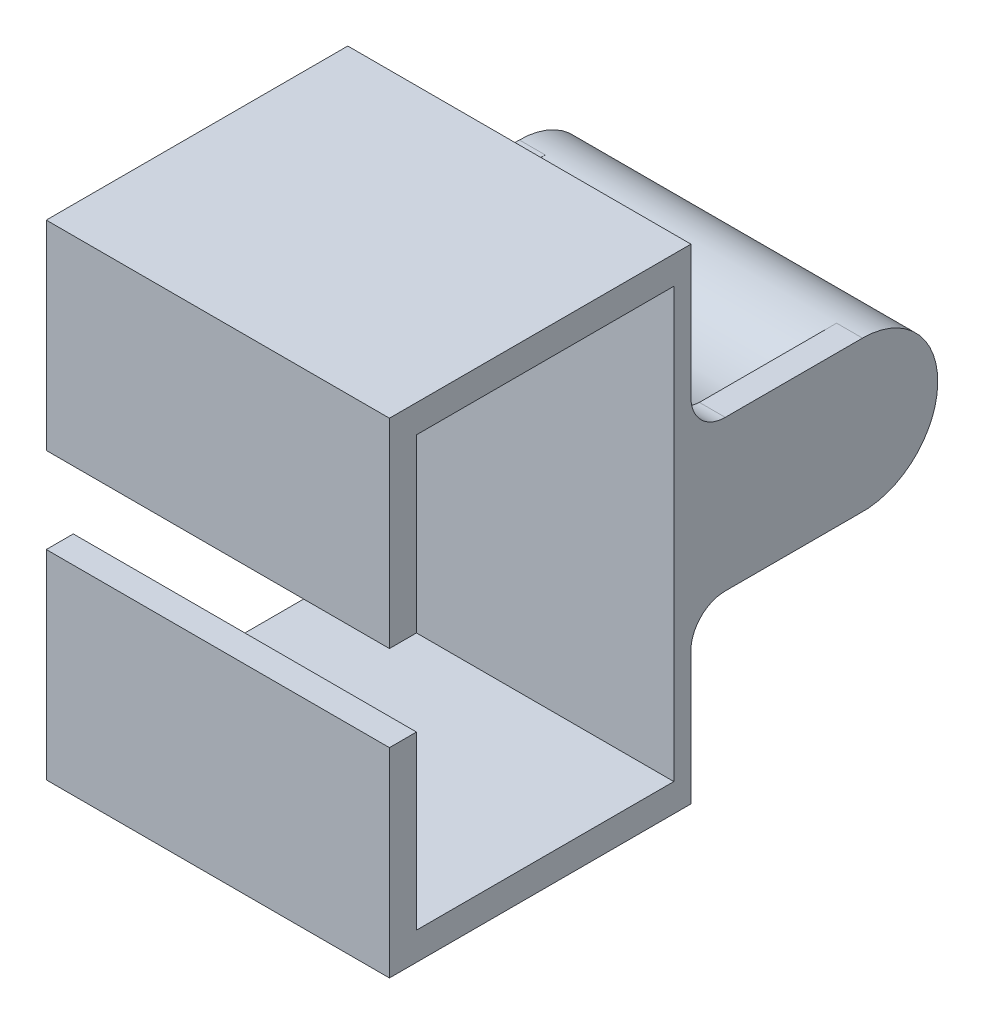
ISO-10303-21;
HEADER;
FILE_DESCRIPTION(('STEP AP214'),'2;1');
FILE_NAME('part.step','',(''),(''),'','','');
FILE_SCHEMA(('AUTOMOTIVE_DESIGN { 1 0 10303 214 1 1 1 1 }'));
ENDSEC;
DATA;
#1=APPLICATION_CONTEXT('core data for automotive mechanical design processes');
#2=APPLICATION_PROTOCOL_DEFINITION('international standard','automotive_design',2000,#1);
#3=PRODUCT_CONTEXT('',#1,'mechanical');
#4=PRODUCT('Part','Part','',(#3));
#5=PRODUCT_RELATED_PRODUCT_CATEGORY('part','',(#4));
#6=PRODUCT_DEFINITION_FORMATION('','',#4);
#7=PRODUCT_DEFINITION_CONTEXT('part definition',#1,'design');
#8=PRODUCT_DEFINITION('design','',#6,#7);
#9=PRODUCT_DEFINITION_SHAPE('','',#8);
#10=(LENGTH_UNIT() NAMED_UNIT(*) SI_UNIT(.MILLI.,.METRE.));
#11=(NAMED_UNIT(*) PLANE_ANGLE_UNIT() SI_UNIT($,.RADIAN.));
#12=(NAMED_UNIT(*) SI_UNIT($,.STERADIAN.) SOLID_ANGLE_UNIT());
#13=UNCERTAINTY_MEASURE_WITH_UNIT(LENGTH_MEASURE(1.E-05),#10,'distance_accuracy_value','');
#14=(GEOMETRIC_REPRESENTATION_CONTEXT(3) GLOBAL_UNCERTAINTY_ASSIGNED_CONTEXT((#13)) GLOBAL_UNIT_ASSIGNED_CONTEXT((#10,
#11,#12)) REPRESENTATION_CONTEXT('',''));
#15=CARTESIAN_POINT('',(0.,0.,0.));
#16=DIRECTION('',(0.,0.,1.));
#17=DIRECTION('',(1.,0.,0.));
#18=AXIS2_PLACEMENT_3D('',#15,#16,#17);
#19=CARTESIAN_POINT('',(50.8,-31.75,25.4));
#20=DIRECTION('',(0.,0.,1.));
#21=DIRECTION('',(1.,0.,0.));
#22=AXIS2_PLACEMENT_3D('',#19,#20,#21);
#23=PLANE('',#22);
#24=DIRECTION('',(0.,1.,0.));
#25=VECTOR('',#24,1.);
#26=CARTESIAN_POINT('',(50.8,-31.75,25.4));
#27=LINE('',#26,#25);
#28=CARTESIAN_POINT('',(50.8,16.2161216276526,25.4));
#29=VERTEX_POINT('',#28);
#30=CARTESIAN_POINT('',(50.8,35.8829392958493,25.4));
#31=VERTEX_POINT('',#30);
#32=EDGE_CURVE('E360',#29,#31,#27,.T.);
#33=ORIENTED_EDGE('',*,*,#32,.F.);
#34=DIRECTION('',(1.,0.,0.));
#35=VECTOR('',#34,1.);
#36=CARTESIAN_POINT('',(50.8,16.2161216276526,25.4));
#37=LINE('',#36,#35);
#38=CARTESIAN_POINT('',(41.8853644342479,16.2161216276526,25.4));
#39=VERTEX_POINT('',#38);
#40=EDGE_CURVE('E422',#29,#39,#37,.F.);
#41=ORIENTED_EDGE('',*,*,#40,.T.);
#42=DIRECTION('',(0.,-1.,0.));
#43=VECTOR('',#42,1.);
#44=CARTESIAN_POINT('',(41.8853644342479,-11.1252,25.4));
#45=LINE('',#44,#43);
#46=CARTESIAN_POINT('',(41.8853644342479,-16.2052,25.4));
#47=VERTEX_POINT('',#46);
#48=EDGE_CURVE('E419',#39,#47,#45,.T.);
#49=ORIENTED_EDGE('',*,*,#48,.T.);
#50=DIRECTION('',(1.,0.,0.));
#51=VECTOR('',#50,1.);
#52=CARTESIAN_POINT('',(50.8,-16.2052,25.4));
#53=LINE('',#52,#51);
#54=CARTESIAN_POINT('',(50.8,-16.2052,25.4));
#55=VERTEX_POINT('',#54);
#56=EDGE_CURVE('E418',#47,#55,#53,.T.);
#57=ORIENTED_EDGE('',*,*,#56,.T.);
#58=CARTESIAN_POINT('',(50.8,-35.8829392958493,25.4));
#59=VERTEX_POINT('',#58);
#60=EDGE_CURVE('E353',#59,#55,#27,.T.);
#61=ORIENTED_EDGE('',*,*,#60,.F.);
#62=DIRECTION('',(-1.,0.,0.));
#63=VECTOR('',#62,1.);
#64=CARTESIAN_POINT('',(50.8,-35.8829392958493,25.4));
#65=LINE('',#64,#63);
#66=CARTESIAN_POINT('',(0.,-35.8829392958493,25.4));
#67=VERTEX_POINT('',#66);
#68=EDGE_CURVE('E316',#59,#67,#65,.T.);
#69=ORIENTED_EDGE('',*,*,#68,.T.);
#70=DIRECTION('',(0.,1.,0.));
#71=VECTOR('',#70,1.);
#72=CARTESIAN_POINT('',(0.,-31.75,25.4));
#73=LINE('',#72,#71);
#74=CARTESIAN_POINT('',(0.,-16.2052,25.4));
#75=VERTEX_POINT('',#74);
#76=EDGE_CURVE('E361',#67,#75,#73,.T.);
#77=ORIENTED_EDGE('',*,*,#76,.T.);
#78=DIRECTION('',(-1.,0.,0.));
#79=VECTOR('',#78,1.);
#80=CARTESIAN_POINT('',(50.8,-16.2052,25.4));
#81=LINE('',#80,#79);
#82=CARTESIAN_POINT('',(8.91463556575211,-16.2052,25.4));
#83=VERTEX_POINT('',#82);
#84=EDGE_CURVE('E406',#75,#83,#81,.F.);
#85=ORIENTED_EDGE('',*,*,#84,.T.);
#86=DIRECTION('',(0.,-1.,0.));
#87=VECTOR('',#86,1.);
#88=CARTESIAN_POINT('',(8.91463556575211,11.1361216276526,25.4));
#89=LINE('',#88,#87);
#90=CARTESIAN_POINT('',(8.91463556575211,16.2161216276526,25.4));
#91=VERTEX_POINT('',#90);
#92=EDGE_CURVE('E408',#83,#91,#89,.F.);
#93=ORIENTED_EDGE('',*,*,#92,.T.);
#94=DIRECTION('',(-1.,0.,0.));
#95=VECTOR('',#94,1.);
#96=CARTESIAN_POINT('',(0.,16.2161216276526,25.4));
#97=LINE('',#96,#95);
#98=CARTESIAN_POINT('',(0.,16.2161216276526,25.4));
#99=VERTEX_POINT('',#98);
#100=EDGE_CURVE('E415',#91,#99,#97,.T.);
#101=ORIENTED_EDGE('',*,*,#100,.T.);
#102=CARTESIAN_POINT('',(0.,35.8829392958493,25.4));
#103=VERTEX_POINT('',#102);
#104=EDGE_CURVE('E333',#99,#103,#73,.T.);
#105=ORIENTED_EDGE('',*,*,#104,.T.);
#106=DIRECTION('',(-1.,0.,0.));
#107=VECTOR('',#106,1.);
#108=CARTESIAN_POINT('',(50.8,35.8829392958493,25.4));
#109=LINE('',#108,#107);
#110=EDGE_CURVE('E281',#31,#103,#109,.T.);
#111=ORIENTED_EDGE('',*,*,#110,.F.);
#112=EDGE_LOOP('',(#33,#41,#49,#57,#61,#69,#77,#85,#93,#101,#105,#111));
#113=FACE_BOUND('',#112,.T.);
#114=ADVANCED_FACE('F50',(#113),#23,.F.);
#115=CARTESIAN_POINT('',(50.8,0.,0.));
#116=DIRECTION('',(-1.,0.,0.));
#117=DIRECTION('',(0.,0.,1.));
#118=AXIS2_PLACEMENT_3D('',#115,#116,#117);
#119=CYLINDRICAL_SURFACE('',#118,11.1361216276526);
#120=CARTESIAN_POINT('',(50.8,0.,0.));
#121=DIRECTION('',(1.,0.,0.));
#122=DIRECTION('',(0.,0.,-1.));
#123=AXIS2_PLACEMENT_3D('',#120,#121,#122);
#124=CIRCLE('',#123,11.1361216276526);
#125=CARTESIAN_POINT('',(50.8,-11.1252,0.493082007248803));
#126=VERTEX_POINT('',#125);
#127=CARTESIAN_POINT('',(50.8,11.1361216276526,0.));
#128=VERTEX_POINT('',#127);
#129=EDGE_CURVE('E234',#126,#128,#124,.T.);
#130=ORIENTED_EDGE('',*,*,#129,.F.);
#131=DIRECTION('',(-1.,0.,0.));
#132=VECTOR('',#131,1.);
#133=CARTESIAN_POINT('',(50.8,-11.1252,0.493082007248858));
#134=LINE('',#133,#132);
#135=CARTESIAN_POINT('',(46.9653644342479,-11.1252,0.493082007248803));
#136=VERTEX_POINT('',#135);
#137=EDGE_CURVE('E220',#126,#136,#134,.T.);
#138=ORIENTED_EDGE('',*,*,#137,.T.);
#139=CARTESIAN_POINT('',(46.9653644342479,0.,0.));
#140=DIRECTION('',(1.,0.,0.));
#141=DIRECTION('',(0.,0.,-1.));
#142=AXIS2_PLACEMENT_3D('',#139,#140,#141);
#143=CIRCLE('',#142,11.1361216276526);
#144=CARTESIAN_POINT('',(46.9653644342479,11.1361216276526,0.));
#145=VERTEX_POINT('',#144);
#146=EDGE_CURVE('E233',#145,#136,#143,.T.);
#147=ORIENTED_EDGE('',*,*,#146,.F.);
#148=DIRECTION('',(1.,0.,0.));
#149=VECTOR('',#148,1.);
#150=CARTESIAN_POINT('',(46.9653644342479,11.1361216276526,0.));
#151=LINE('',#150,#149);
#152=EDGE_CURVE('E245',#145,#128,#151,.T.);
#153=ORIENTED_EDGE('',*,*,#152,.T.);
#154=EDGE_LOOP('',(#130,#138,#147,#153));
#155=FACE_BOUND('',#154,.T.);
#156=DIRECTION('',(-1.,0.,0.));
#157=VECTOR('',#156,1.);
#158=CARTESIAN_POINT('',(3.83463556575211,11.1361216276526,0.));
#159=LINE('',#158,#157);
#160=CARTESIAN_POINT('',(3.83463556575211,11.1361216276526,0.));
#161=VERTEX_POINT('',#160);
#162=CARTESIAN_POINT('',(0.,11.1361216276526,0.));
#163=VERTEX_POINT('',#162);
#164=EDGE_CURVE('E383',#161,#163,#159,.T.);
#165=ORIENTED_EDGE('',*,*,#164,.F.);
#166=CARTESIAN_POINT('',(3.83463556575211,0.,0.));
#167=DIRECTION('',(-1.,0.,0.));
#168=DIRECTION('',(0.,0.,1.));
#169=AXIS2_PLACEMENT_3D('',#166,#167,#168);
#170=CIRCLE('',#169,11.1361216276526);
#171=CARTESIAN_POINT('',(3.83463556575211,-11.1252,0.493082007248803));
#172=VERTEX_POINT('',#171);
#173=EDGE_CURVE('E397',#172,#161,#170,.T.);
#174=ORIENTED_EDGE('',*,*,#173,.F.);
#175=DIRECTION('',(-1.,0.,0.));
#176=VECTOR('',#175,1.);
#177=CARTESIAN_POINT('',(50.8,-11.1252,0.493082007248858));
#178=LINE('',#177,#176);
#179=CARTESIAN_POINT('',(0.,-11.1252,0.493082007248803));
#180=VERTEX_POINT('',#179);
#181=EDGE_CURVE('E392',#172,#180,#178,.T.);
#182=ORIENTED_EDGE('',*,*,#181,.T.);
#183=CARTESIAN_POINT('',(0.,0.,0.));
#184=DIRECTION('',(1.,0.,0.));
#185=DIRECTION('',(0.,0.,-1.));
#186=AXIS2_PLACEMENT_3D('',#183,#184,#185);
#187=CIRCLE('',#186,11.1361216276526);
#188=EDGE_CURVE('E396',#180,#163,#187,.T.);
#189=ORIENTED_EDGE('',*,*,#188,.T.);
#190=EDGE_LOOP('',(#165,#174,#182,#189));
#191=FACE_BOUND('',#190,.T.);
#192=ADVANCED_FACE('F230',(#155,#191),#119,.T.);
#193=CARTESIAN_POINT('',(50.8,0.,0.));
#194=DIRECTION('',(1.,0.,0.));
#195=DIRECTION('',(0.,0.,-1.));
#196=AXIS2_PLACEMENT_3D('',#193,#194,#195);
#197=PLANE('',#196);
#198=ORIENTED_EDGE('',*,*,#129,.T.);
#199=DIRECTION('',(0.,0.,1.));
#200=VECTOR('',#199,1.);
#201=CARTESIAN_POINT('',(50.8,11.1361216276526,25.4));
#202=LINE('',#201,#200);
#203=CARTESIAN_POINT('',(50.8,11.1361216276526,20.32));
#204=VERTEX_POINT('',#203);
#205=EDGE_CURVE('E222',#128,#204,#202,.T.);
#206=ORIENTED_EDGE('',*,*,#205,.T.);
#207=CARTESIAN_POINT('',(50.8,16.2161216276526,20.32));
#208=DIRECTION('',(1.,0.,0.));
#209=DIRECTION('',(0.,0.,-1.));
#210=AXIS2_PLACEMENT_3D('',#207,#208,#209);
#211=CIRCLE('',#210,5.08);
#212=EDGE_CURVE('E443',#204,#29,#211,.F.);
#213=ORIENTED_EDGE('',*,*,#212,.T.);
#214=ORIENTED_EDGE('',*,*,#32,.T.);
#215=DIRECTION('',(0.,0.,1.));
#216=VECTOR('',#215,1.);
#217=CARTESIAN_POINT('',(50.8,35.8829392958493,25.4));
#218=LINE('',#217,#216);
#219=CARTESIAN_POINT('',(50.8,35.8829392958493,70.0325993691097));
#220=VERTEX_POINT('',#219);
#221=EDGE_CURVE('E345',#31,#220,#218,.T.);
#222=ORIENTED_EDGE('',*,*,#221,.T.);
#223=DIRECTION('',(0.,-1.,0.));
#224=VECTOR('',#223,1.);
#225=CARTESIAN_POINT('',(50.8,35.8829392958493,70.0325993691097));
#226=LINE('',#225,#224);
#227=CARTESIAN_POINT('',(50.8,6.35,70.0325993691097));
#228=VERTEX_POINT('',#227);
#229=EDGE_CURVE('E296',#220,#228,#226,.T.);
#230=ORIENTED_EDGE('',*,*,#229,.T.);
#231=DIRECTION('',(0.,0.,-1.));
#232=VECTOR('',#231,1.);
#233=CARTESIAN_POINT('',(50.8,6.35,66.0308981031821));
#234=LINE('',#233,#232);
#235=CARTESIAN_POINT('',(50.8,6.35,66.0308981031821));
#236=VERTEX_POINT('',#235);
#237=EDGE_CURVE('E306',#228,#236,#234,.T.);
#238=ORIENTED_EDGE('',*,*,#237,.T.);
#239=DIRECTION('',(0.,1.,0.));
#240=VECTOR('',#239,1.);
#241=CARTESIAN_POINT('',(50.8,35.8829392958493,66.0308981031821));
#242=LINE('',#241,#240);
#243=CARTESIAN_POINT('',(50.8,31.75,66.0308981031821));
#244=VERTEX_POINT('',#243);
#245=EDGE_CURVE('E291',#236,#244,#242,.T.);
#246=ORIENTED_EDGE('',*,*,#245,.T.);
#247=DIRECTION('',(0.,0.,-1.));
#248=VECTOR('',#247,1.);
#249=CARTESIAN_POINT('',(50.8,31.75,25.4));
#250=LINE('',#249,#248);
#251=CARTESIAN_POINT('',(50.8,31.75,27.9308981031821));
#252=VERTEX_POINT('',#251);
#253=EDGE_CURVE('E346',#244,#252,#250,.T.);
#254=ORIENTED_EDGE('',*,*,#253,.T.);
#255=DIRECTION('',(0.,-1.,0.));
#256=VECTOR('',#255,1.);
#257=CARTESIAN_POINT('',(50.8,-31.75,27.9308981031821));
#258=LINE('',#257,#256);
#259=CARTESIAN_POINT('',(50.8,-31.75,27.9308981031821));
#260=VERTEX_POINT('',#259);
#261=EDGE_CURVE('E356',#252,#260,#258,.T.);
#262=ORIENTED_EDGE('',*,*,#261,.T.);
#263=DIRECTION('',(0.,0.,1.));
#264=VECTOR('',#263,1.);
#265=CARTESIAN_POINT('',(50.8,-31.75,25.4));
#266=LINE('',#265,#264);
#267=CARTESIAN_POINT('',(50.8,-31.75,66.0308981031821));
#268=VERTEX_POINT('',#267);
#269=EDGE_CURVE('E311',#260,#268,#266,.T.);
#270=ORIENTED_EDGE('',*,*,#269,.T.);
#271=DIRECTION('',(0.,1.,0.));
#272=VECTOR('',#271,1.);
#273=CARTESIAN_POINT('',(50.8,-35.8829392958493,66.0308981031821));
#274=LINE('',#273,#272);
#275=CARTESIAN_POINT('',(50.8,-6.34999999999999,66.0308981031821));
#276=VERTEX_POINT('',#275);
#277=EDGE_CURVE('E247',#268,#276,#274,.T.);
#278=ORIENTED_EDGE('',*,*,#277,.T.);
#279=DIRECTION('',(0.,0.,1.));
#280=VECTOR('',#279,1.);
#281=CARTESIAN_POINT('',(50.8,-6.34999999999999,66.0308981031821));
#282=LINE('',#281,#280);
#283=CARTESIAN_POINT('',(50.8,-6.34999999999999,70.0325993691097));
#284=VERTEX_POINT('',#283);
#285=EDGE_CURVE('E252',#276,#284,#282,.T.);
#286=ORIENTED_EDGE('',*,*,#285,.T.);
#287=DIRECTION('',(0.,-1.,0.));
#288=VECTOR('',#287,1.);
#289=CARTESIAN_POINT('',(50.8,-35.8829392958493,70.0325993691097));
#290=LINE('',#289,#288);
#291=CARTESIAN_POINT('',(50.8,-35.8829392958493,70.0325993691097));
#292=VERTEX_POINT('',#291);
#293=EDGE_CURVE('E253',#284,#292,#290,.T.);
#294=ORIENTED_EDGE('',*,*,#293,.T.);
#295=DIRECTION('',(0.,0.,-1.));
#296=VECTOR('',#295,1.);
#297=CARTESIAN_POINT('',(50.8,-35.8829392958493,25.4));
#298=LINE('',#297,#296);
#299=EDGE_CURVE('E313',#292,#59,#298,.T.);
#300=ORIENTED_EDGE('',*,*,#299,.T.);
#301=ORIENTED_EDGE('',*,*,#60,.T.);
#302=CARTESIAN_POINT('',(50.8,-16.2052,20.32));
#303=DIRECTION('',(1.,0.,0.));
#304=DIRECTION('',(0.,0.,-1.));
#305=AXIS2_PLACEMENT_3D('',#302,#303,#304);
#306=CIRCLE('',#305,5.08);
#307=CARTESIAN_POINT('',(50.8,-11.1252,20.32));
#308=VERTEX_POINT('',#307);
#309=EDGE_CURVE('E60',#55,#308,#306,.F.);
#310=ORIENTED_EDGE('',*,*,#309,.T.);
#311=DIRECTION('',(0.,0.,-1.));
#312=VECTOR('',#311,1.);
#313=CARTESIAN_POINT('',(50.8,-11.1252,25.4));
#314=LINE('',#313,#312);
#315=EDGE_CURVE('E456',#308,#126,#314,.T.);
#316=ORIENTED_EDGE('',*,*,#315,.T.);
#317=EDGE_LOOP('',(#198,#206,#213,#214,#222,#230,#238,#246,#254,#262,#270,#278,#286,#294,#300,
#301,#310,#316));
#318=FACE_BOUND('',#317,.T.);
#319=ADVANCED_FACE('F476',(#318),#197,.T.);
#320=CARTESIAN_POINT('',(0.,0.,0.));
#321=DIRECTION('',(1.,0.,0.));
#322=DIRECTION('',(0.,0.,-1.));
#323=AXIS2_PLACEMENT_3D('',#320,#321,#322);
#324=PLANE('',#323);
#325=ORIENTED_EDGE('',*,*,#188,.F.);
#326=DIRECTION('',(0.,0.,1.));
#327=VECTOR('',#326,1.);
#328=CARTESIAN_POINT('',(0.,-11.1252,0.));
#329=LINE('',#328,#327);
#330=CARTESIAN_POINT('',(0.,-11.1252,20.32));
#331=VERTEX_POINT('',#330);
#332=EDGE_CURVE('E380',#180,#331,#329,.T.);
#333=ORIENTED_EDGE('',*,*,#332,.T.);
#334=CARTESIAN_POINT('',(0.,-16.2052,20.32));
#335=DIRECTION('',(1.,0.,0.));
#336=DIRECTION('',(0.,0.,-1.));
#337=AXIS2_PLACEMENT_3D('',#334,#335,#336);
#338=CIRCLE('',#337,5.08);
#339=EDGE_CURVE('E11',#331,#75,#338,.T.);
#340=ORIENTED_EDGE('',*,*,#339,.T.);
#341=ORIENTED_EDGE('',*,*,#76,.F.);
#342=DIRECTION('',(0.,0.,-1.));
#343=VECTOR('',#342,1.);
#344=CARTESIAN_POINT('',(0.,-35.8829392958493,25.4));
#345=LINE('',#344,#343);
#346=CARTESIAN_POINT('',(0.,-35.8829392958493,70.0325993691097));
#347=VERTEX_POINT('',#346);
#348=EDGE_CURVE('E314',#347,#67,#345,.T.);
#349=ORIENTED_EDGE('',*,*,#348,.F.);
#350=DIRECTION('',(0.,-1.,0.));
#351=VECTOR('',#350,1.);
#352=CARTESIAN_POINT('',(0.,-35.8829392958493,70.0325993691097));
#353=LINE('',#352,#351);
#354=CARTESIAN_POINT('',(0.,-6.34999999999999,70.0325993691097));
#355=VERTEX_POINT('',#354);
#356=EDGE_CURVE('E255',#355,#347,#353,.T.);
#357=ORIENTED_EDGE('',*,*,#356,.F.);
#358=DIRECTION('',(0.,0.,1.));
#359=VECTOR('',#358,1.);
#360=CARTESIAN_POINT('',(0.,-6.34999999999999,66.0308981031821));
#361=LINE('',#360,#359);
#362=CARTESIAN_POINT('',(0.,-6.34999999999999,66.0308981031821));
#363=VERTEX_POINT('',#362);
#364=EDGE_CURVE('E263',#363,#355,#361,.T.);
#365=ORIENTED_EDGE('',*,*,#364,.F.);
#366=DIRECTION('',(0.,1.,0.));
#367=VECTOR('',#366,1.);
#368=CARTESIAN_POINT('',(0.,-35.8829392958493,66.0308981031821));
#369=LINE('',#368,#367);
#370=CARTESIAN_POINT('',(0.,-31.75,66.0308981031821));
#371=VERTEX_POINT('',#370);
#372=EDGE_CURVE('E259',#371,#363,#369,.T.);
#373=ORIENTED_EDGE('',*,*,#372,.F.);
#374=DIRECTION('',(0.,0.,1.));
#375=VECTOR('',#374,1.);
#376=CARTESIAN_POINT('',(0.,-31.75,25.4));
#377=LINE('',#376,#375);
#378=CARTESIAN_POINT('',(0.,-31.75,27.9308981031821));
#379=VERTEX_POINT('',#378);
#380=EDGE_CURVE('E318',#379,#371,#377,.T.);
#381=ORIENTED_EDGE('',*,*,#380,.F.);
#382=DIRECTION('',(0.,-1.,0.));
#383=VECTOR('',#382,1.);
#384=CARTESIAN_POINT('',(0.,-31.75,27.9308981031821));
#385=LINE('',#384,#383);
#386=CARTESIAN_POINT('',(0.,31.75,27.9308981031821));
#387=VERTEX_POINT('',#386);
#388=EDGE_CURVE('E370',#387,#379,#385,.T.);
#389=ORIENTED_EDGE('',*,*,#388,.F.);
#390=DIRECTION('',(0.,0.,-1.));
#391=VECTOR('',#390,1.);
#392=CARTESIAN_POINT('',(0.,31.75,25.4));
#393=LINE('',#392,#391);
#394=CARTESIAN_POINT('',(0.,31.75,66.0308981031821));
#395=VERTEX_POINT('',#394);
#396=EDGE_CURVE('E322',#395,#387,#393,.T.);
#397=ORIENTED_EDGE('',*,*,#396,.F.);
#398=DIRECTION('',(0.,1.,0.));
#399=VECTOR('',#398,1.);
#400=CARTESIAN_POINT('',(0.,35.8829392958493,66.0308981031821));
#401=LINE('',#400,#399);
#402=CARTESIAN_POINT('',(0.,6.35,66.0308981031821));
#403=VERTEX_POINT('',#402);
#404=EDGE_CURVE('E295',#403,#395,#401,.T.);
#405=ORIENTED_EDGE('',*,*,#404,.F.);
#406=DIRECTION('',(0.,0.,-1.));
#407=VECTOR('',#406,1.);
#408=CARTESIAN_POINT('',(0.,6.35,66.0308981031821));
#409=LINE('',#408,#407);
#410=CARTESIAN_POINT('',(0.,6.35,70.0325993691097));
#411=VERTEX_POINT('',#410);
#412=EDGE_CURVE('E300',#411,#403,#409,.T.);
#413=ORIENTED_EDGE('',*,*,#412,.F.);
#414=DIRECTION('',(0.,-1.,0.));
#415=VECTOR('',#414,1.);
#416=CARTESIAN_POINT('',(0.,35.8829392958493,70.0325993691097));
#417=LINE('',#416,#415);
#418=CARTESIAN_POINT('',(0.,35.8829392958493,70.0325993691097));
#419=VERTEX_POINT('',#418);
#420=EDGE_CURVE('E262',#419,#411,#417,.T.);
#421=ORIENTED_EDGE('',*,*,#420,.F.);
#422=DIRECTION('',(0.,0.,1.));
#423=VECTOR('',#422,1.);
#424=CARTESIAN_POINT('',(0.,35.8829392958493,25.4));
#425=LINE('',#424,#423);
#426=EDGE_CURVE('E342',#103,#419,#425,.T.);
#427=ORIENTED_EDGE('',*,*,#426,.F.);
#428=ORIENTED_EDGE('',*,*,#104,.F.);
#429=CARTESIAN_POINT('',(0.,16.2161216276526,20.32));
#430=DIRECTION('',(1.,0.,0.));
#431=DIRECTION('',(0.,0.,-1.));
#432=AXIS2_PLACEMENT_3D('',#429,#430,#431);
#433=CIRCLE('',#432,5.08);
#434=CARTESIAN_POINT('',(0.,11.1361216276526,20.32));
#435=VERTEX_POINT('',#434);
#436=EDGE_CURVE('E441',#99,#435,#433,.T.);
#437=ORIENTED_EDGE('',*,*,#436,.T.);
#438=DIRECTION('',(0.,0.,1.));
#439=VECTOR('',#438,1.);
#440=CARTESIAN_POINT('',(0.,11.1361216276526,0.));
#441=LINE('',#440,#439);
#442=EDGE_CURVE('E385',#163,#435,#441,.T.);
#443=ORIENTED_EDGE('',*,*,#442,.F.);
#444=EDGE_LOOP('',(#325,#333,#340,#341,#349,#357,#365,#373,#381,#389,#397,#405,#413,#421,#427,
#428,#437,#443));
#445=FACE_BOUND('',#444,.T.);
#446=ADVANCED_FACE('F498',(#445),#324,.F.);
#447=CARTESIAN_POINT('',(3.83463556575211,-11.1252,0.));
#448=DIRECTION('',(0.,-1.,0.));
#449=DIRECTION('',(0.,0.,-1.));
#450=AXIS2_PLACEMENT_3D('',#447,#448,#449);
#451=PLANE('',#450);
#452=DIRECTION('',(0.,0.,1.));
#453=VECTOR('',#452,1.);
#454=CARTESIAN_POINT('',(3.83463556575211,-11.1252,0.));
#455=LINE('',#454,#453);
#456=CARTESIAN_POINT('',(3.83463556575211,-11.1252,20.32));
#457=VERTEX_POINT('',#456);
#458=EDGE_CURVE('E377',#172,#457,#455,.T.);
#459=ORIENTED_EDGE('',*,*,#458,.T.);
#460=DIRECTION('',(-1.,0.,0.));
#461=VECTOR('',#460,1.);
#462=CARTESIAN_POINT('',(3.83463556575211,-11.1252,20.32));
#463=LINE('',#462,#461);
#464=EDGE_CURVE('E64',#457,#331,#463,.T.);
#465=ORIENTED_EDGE('',*,*,#464,.T.);
#466=ORIENTED_EDGE('',*,*,#332,.F.);
#467=ORIENTED_EDGE('',*,*,#181,.F.);
#468=EDGE_LOOP('',(#459,#465,#466,#467));
#469=FACE_BOUND('',#468,.T.);
#470=ADVANCED_FACE('F572',(#469),#451,.T.);
#471=CARTESIAN_POINT('',(3.83463556575211,11.1361216276526,0.));
#472=DIRECTION('',(0.,-1.,0.));
#473=DIRECTION('',(0.,0.,-1.));
#474=AXIS2_PLACEMENT_3D('',#471,#472,#473);
#475=PLANE('',#474);
#476=ORIENTED_EDGE('',*,*,#442,.T.);
#477=DIRECTION('',(-1.,0.,0.));
#478=VECTOR('',#477,1.);
#479=CARTESIAN_POINT('',(3.83463556575211,11.1361216276526,20.32));
#480=LINE('',#479,#478);
#481=CARTESIAN_POINT('',(3.83463556575211,11.1361216276526,20.32));
#482=VERTEX_POINT('',#481);
#483=EDGE_CURVE('E424',#435,#482,#480,.F.);
#484=ORIENTED_EDGE('',*,*,#483,.T.);
#485=DIRECTION('',(0.,0.,1.));
#486=VECTOR('',#485,1.);
#487=CARTESIAN_POINT('',(3.83463556575211,11.1361216276526,0.));
#488=LINE('',#487,#486);
#489=EDGE_CURVE('E382',#161,#482,#488,.T.);
#490=ORIENTED_EDGE('',*,*,#489,.F.);
#491=ORIENTED_EDGE('',*,*,#164,.T.);
#492=EDGE_LOOP('',(#476,#484,#490,#491));
#493=FACE_BOUND('',#492,.T.);
#494=ADVANCED_FACE('F569',(#493),#475,.F.);
#495=CARTESIAN_POINT('',(3.83463556575211,0.,0.));
#496=DIRECTION('',(-1.,0.,0.));
#497=DIRECTION('',(0.,0.,1.));
#498=AXIS2_PLACEMENT_3D('',#495,#496,#497);
#499=PLANE('',#498);
#500=ORIENTED_EDGE('',*,*,#489,.T.);
#501=DIRECTION('',(0.,-1.,0.));
#502=VECTOR('',#501,1.);
#503=CARTESIAN_POINT('',(3.83463556575211,-11.1252,20.32));
#504=LINE('',#503,#502);
#505=EDGE_CURVE('E75',#482,#457,#504,.T.);
#506=ORIENTED_EDGE('',*,*,#505,.T.);
#507=ORIENTED_EDGE('',*,*,#458,.F.);
#508=ORIENTED_EDGE('',*,*,#173,.T.);
#509=EDGE_LOOP('',(#500,#506,#507,#508));
#510=FACE_BOUND('',#509,.T.);
#511=ADVANCED_FACE('F570',(#510),#499,.F.);
#512=CARTESIAN_POINT('',(50.8,-31.75,27.9308981031821));
#513=DIRECTION('',(0.,0.,-1.));
#514=DIRECTION('',(-1.,0.,0.));
#515=AXIS2_PLACEMENT_3D('',#512,#513,#514);
#516=PLANE('',#515);
#517=ORIENTED_EDGE('',*,*,#388,.T.);
#518=DIRECTION('',(-1.,0.,0.));
#519=VECTOR('',#518,1.);
#520=CARTESIAN_POINT('',(50.8,-31.75,27.9308981031821));
#521=LINE('',#520,#519);
#522=EDGE_CURVE('E365',#260,#379,#521,.T.);
#523=ORIENTED_EDGE('',*,*,#522,.F.);
#524=ORIENTED_EDGE('',*,*,#261,.F.);
#525=DIRECTION('',(-1.,0.,0.));
#526=VECTOR('',#525,1.);
#527=CARTESIAN_POINT('',(50.8,31.75,27.9308981031821));
#528=LINE('',#527,#526);
#529=EDGE_CURVE('E373',#252,#387,#528,.T.);
#530=ORIENTED_EDGE('',*,*,#529,.T.);
#531=EDGE_LOOP('',(#517,#523,#524,#530));
#532=FACE_BOUND('',#531,.T.);
#533=ADVANCED_FACE('F527',(#532),#516,.F.);
#534=CARTESIAN_POINT('',(50.8,31.75,25.4));
#535=DIRECTION('',(0.,1.,0.));
#536=DIRECTION('',(0.,0.,1.));
#537=AXIS2_PLACEMENT_3D('',#534,#535,#536);
#538=PLANE('',#537);
#539=ORIENTED_EDGE('',*,*,#529,.F.);
#540=ORIENTED_EDGE('',*,*,#253,.F.);
#541=DIRECTION('',(-1.,0.,0.));
#542=VECTOR('',#541,1.);
#543=CARTESIAN_POINT('',(50.8,31.75,66.0308981031821));
#544=LINE('',#543,#542);
#545=EDGE_CURVE('E336',#244,#395,#544,.T.);
#546=ORIENTED_EDGE('',*,*,#545,.T.);
#547=ORIENTED_EDGE('',*,*,#396,.T.);
#548=EDGE_LOOP('',(#539,#540,#546,#547));
#549=FACE_BOUND('',#548,.T.);
#550=ADVANCED_FACE('F522',(#549),#538,.F.);
#551=CARTESIAN_POINT('',(50.8,35.8829392958493,25.4));
#552=DIRECTION('',(0.,-1.,0.));
#553=DIRECTION('',(0.,0.,-1.));
#554=AXIS2_PLACEMENT_3D('',#551,#552,#553);
#555=PLANE('',#554);
#556=ORIENTED_EDGE('',*,*,#426,.T.);
#557=DIRECTION('',(-1.,0.,0.));
#558=VECTOR('',#557,1.);
#559=CARTESIAN_POINT('',(50.8,35.8829392958493,70.0325993691097));
#560=LINE('',#559,#558);
#561=EDGE_CURVE('E236',#220,#419,#560,.T.);
#562=ORIENTED_EDGE('',*,*,#561,.F.);
#563=ORIENTED_EDGE('',*,*,#221,.F.);
#564=ORIENTED_EDGE('',*,*,#110,.T.);
#565=EDGE_LOOP('',(#556,#562,#563,#564));
#566=FACE_BOUND('',#565,.T.);
#567=ADVANCED_FACE('F507',(#566),#555,.F.);
#568=CARTESIAN_POINT('',(50.8,-31.75,25.4));
#569=DIRECTION('',(0.,-1.,0.));
#570=DIRECTION('',(0.,0.,-1.));
#571=AXIS2_PLACEMENT_3D('',#568,#569,#570);
#572=PLANE('',#571);
#573=ORIENTED_EDGE('',*,*,#269,.F.);
#574=ORIENTED_EDGE('',*,*,#522,.T.);
#575=ORIENTED_EDGE('',*,*,#380,.T.);
#576=DIRECTION('',(-1.,0.,0.));
#577=VECTOR('',#576,1.);
#578=CARTESIAN_POINT('',(50.8,-31.75,66.0308981031821));
#579=LINE('',#578,#577);
#580=EDGE_CURVE('E329',#268,#371,#579,.T.);
#581=ORIENTED_EDGE('',*,*,#580,.F.);
#582=EDGE_LOOP('',(#573,#574,#575,#581));
#583=FACE_BOUND('',#582,.T.);
#584=ADVANCED_FACE('F534',(#583),#572,.F.);
#585=CARTESIAN_POINT('',(50.8,-35.8829392958493,25.4));
#586=DIRECTION('',(0.,1.,0.));
#587=DIRECTION('',(0.,0.,1.));
#588=AXIS2_PLACEMENT_3D('',#585,#586,#587);
#589=PLANE('',#588);
#590=ORIENTED_EDGE('',*,*,#348,.T.);
#591=ORIENTED_EDGE('',*,*,#68,.F.);
#592=ORIENTED_EDGE('',*,*,#299,.F.);
#593=DIRECTION('',(-1.,0.,0.));
#594=VECTOR('',#593,1.);
#595=CARTESIAN_POINT('',(50.8,-35.8829392958493,70.0325993691097));
#596=LINE('',#595,#594);
#597=EDGE_CURVE('E258',#292,#347,#596,.T.);
#598=ORIENTED_EDGE('',*,*,#597,.T.);
#599=EDGE_LOOP('',(#590,#591,#592,#598));
#600=FACE_BOUND('',#599,.T.);
#601=ADVANCED_FACE('F484',(#600),#589,.F.);
#602=CARTESIAN_POINT('',(50.8,-35.8829392958493,66.0308981031821));
#603=DIRECTION('',(0.,0.,1.));
#604=DIRECTION('',(0.,-1.,0.));
#605=AXIS2_PLACEMENT_3D('',#602,#603,#604);
#606=PLANE('',#605);
#607=ORIENTED_EDGE('',*,*,#277,.F.);
#608=ORIENTED_EDGE('',*,*,#580,.T.);
#609=ORIENTED_EDGE('',*,*,#372,.T.);
#610=DIRECTION('',(-1.,0.,0.));
#611=VECTOR('',#610,1.);
#612=CARTESIAN_POINT('',(50.8,-6.34999999999999,66.0308981031821));
#613=LINE('',#612,#611);
#614=EDGE_CURVE('E280',#276,#363,#613,.T.);
#615=ORIENTED_EDGE('',*,*,#614,.F.);
#616=EDGE_LOOP('',(#607,#608,#609,#615));
#617=FACE_BOUND('',#616,.T.);
#618=ADVANCED_FACE('F541',(#617),#606,.F.);
#619=CARTESIAN_POINT('',(50.8,-6.34999999999999,66.0308981031821));
#620=DIRECTION('',(0.,-1.,0.));
#621=DIRECTION('',(0.,0.,-1.));
#622=AXIS2_PLACEMENT_3D('',#619,#620,#621);
#623=PLANE('',#622);
#624=ORIENTED_EDGE('',*,*,#364,.T.);
#625=DIRECTION('',(-1.,0.,0.));
#626=VECTOR('',#625,1.);
#627=CARTESIAN_POINT('',(50.8,-6.34999999999999,70.0325993691097));
#628=LINE('',#627,#626);
#629=EDGE_CURVE('E271',#284,#355,#628,.T.);
#630=ORIENTED_EDGE('',*,*,#629,.F.);
#631=ORIENTED_EDGE('',*,*,#285,.F.);
#632=ORIENTED_EDGE('',*,*,#614,.T.);
#633=EDGE_LOOP('',(#624,#630,#631,#632));
#634=FACE_BOUND('',#633,.T.);
#635=ADVANCED_FACE('F542',(#634),#623,.F.);
#636=CARTESIAN_POINT('',(50.8,-35.8829392958493,70.0325993691097));
#637=DIRECTION('',(0.,0.,-1.));
#638=DIRECTION('',(-1.,0.,0.));
#639=AXIS2_PLACEMENT_3D('',#636,#637,#638);
#640=PLANE('',#639);
#641=ORIENTED_EDGE('',*,*,#356,.T.);
#642=ORIENTED_EDGE('',*,*,#597,.F.);
#643=ORIENTED_EDGE('',*,*,#293,.F.);
#644=ORIENTED_EDGE('',*,*,#629,.T.);
#645=EDGE_LOOP('',(#641,#642,#643,#644));
#646=FACE_BOUND('',#645,.T.);
#647=ADVANCED_FACE('F546',(#646),#640,.F.);
#648=CARTESIAN_POINT('',(50.8,35.8829392958493,70.0325993691097));
#649=DIRECTION('',(0.,0.,-1.));
#650=DIRECTION('',(-1.,0.,0.));
#651=AXIS2_PLACEMENT_3D('',#648,#649,#650);
#652=PLANE('',#651);
#653=ORIENTED_EDGE('',*,*,#420,.T.);
#654=DIRECTION('',(-1.,0.,0.));
#655=VECTOR('',#654,1.);
#656=CARTESIAN_POINT('',(50.8,6.35,70.0325993691097));
#657=LINE('',#656,#655);
#658=EDGE_CURVE('E284',#228,#411,#657,.T.);
#659=ORIENTED_EDGE('',*,*,#658,.F.);
#660=ORIENTED_EDGE('',*,*,#229,.F.);
#661=ORIENTED_EDGE('',*,*,#561,.T.);
#662=EDGE_LOOP('',(#653,#659,#660,#661));
#663=FACE_BOUND('',#662,.T.);
#664=ADVANCED_FACE('F509',(#663),#652,.F.);
#665=CARTESIAN_POINT('',(50.8,6.35,66.0308981031821));
#666=DIRECTION('',(0.,1.,0.));
#667=DIRECTION('',(0.,0.,1.));
#668=AXIS2_PLACEMENT_3D('',#665,#666,#667);
#669=PLANE('',#668);
#670=ORIENTED_EDGE('',*,*,#412,.T.);
#671=DIRECTION('',(-1.,0.,0.));
#672=VECTOR('',#671,1.);
#673=CARTESIAN_POINT('',(50.8,6.35,66.0308981031821));
#674=LINE('',#673,#672);
#675=EDGE_CURVE('E288',#236,#403,#674,.T.);
#676=ORIENTED_EDGE('',*,*,#675,.F.);
#677=ORIENTED_EDGE('',*,*,#237,.F.);
#678=ORIENTED_EDGE('',*,*,#658,.T.);
#679=EDGE_LOOP('',(#670,#676,#677,#678));
#680=FACE_BOUND('',#679,.T.);
#681=ADVANCED_FACE('F520',(#680),#669,.F.);
#682=CARTESIAN_POINT('',(50.8,35.8829392958493,66.0308981031821));
#683=DIRECTION('',(0.,0.,1.));
#684=DIRECTION('',(1.,0.,0.));
#685=AXIS2_PLACEMENT_3D('',#682,#683,#684);
#686=PLANE('',#685);
#687=ORIENTED_EDGE('',*,*,#545,.F.);
#688=ORIENTED_EDGE('',*,*,#245,.F.);
#689=ORIENTED_EDGE('',*,*,#675,.T.);
#690=ORIENTED_EDGE('',*,*,#404,.T.);
#691=EDGE_LOOP('',(#687,#688,#689,#690));
#692=FACE_BOUND('',#691,.T.);
#693=ADVANCED_FACE('F521',(#692),#686,.F.);
#694=CARTESIAN_POINT('',(46.9653644342479,-11.1252,25.4));
#695=DIRECTION('',(0.,-1.,0.));
#696=DIRECTION('',(0.,0.,-1.));
#697=AXIS2_PLACEMENT_3D('',#694,#695,#696);
#698=PLANE('',#697);
#699=ORIENTED_EDGE('',*,*,#315,.F.);
#700=DIRECTION('',(1.,0.,0.));
#701=VECTOR('',#700,1.);
#702=CARTESIAN_POINT('',(46.9653644342479,-11.1252,20.32));
#703=LINE('',#702,#701);
#704=CARTESIAN_POINT('',(46.9653644342479,-11.1252,20.32));
#705=VERTEX_POINT('',#704);
#706=EDGE_CURVE('E217',#308,#705,#703,.F.);
#707=ORIENTED_EDGE('',*,*,#706,.T.);
#708=DIRECTION('',(0.,0.,-1.));
#709=VECTOR('',#708,1.);
#710=CARTESIAN_POINT('',(46.9653644342479,-11.1252,25.4));
#711=LINE('',#710,#709);
#712=EDGE_CURVE('E212',#705,#136,#711,.T.);
#713=ORIENTED_EDGE('',*,*,#712,.T.);
#714=ORIENTED_EDGE('',*,*,#137,.F.);
#715=EDGE_LOOP('',(#699,#707,#713,#714));
#716=FACE_BOUND('',#715,.T.);
#717=ADVANCED_FACE('F216',(#716),#698,.T.);
#718=CARTESIAN_POINT('',(46.9653644342479,0.,0.));
#719=DIRECTION('',(1.,0.,0.));
#720=DIRECTION('',(0.,0.,-1.));
#721=AXIS2_PLACEMENT_3D('',#718,#719,#720);
#722=PLANE('',#721);
#723=ORIENTED_EDGE('',*,*,#712,.F.);
#724=DIRECTION('',(0.,-1.,0.));
#725=VECTOR('',#724,1.);
#726=CARTESIAN_POINT('',(46.9653644342479,11.1361216276526,20.32));
#727=LINE('',#726,#725);
#728=CARTESIAN_POINT('',(46.9653644342479,11.1361216276526,20.32));
#729=VERTEX_POINT('',#728);
#730=EDGE_CURVE('E432',#705,#729,#727,.F.);
#731=ORIENTED_EDGE('',*,*,#730,.T.);
#732=DIRECTION('',(0.,0.,1.));
#733=VECTOR('',#732,1.);
#734=CARTESIAN_POINT('',(46.9653644342479,11.1361216276526,25.4));
#735=LINE('',#734,#733);
#736=EDGE_CURVE('E223',#145,#729,#735,.T.);
#737=ORIENTED_EDGE('',*,*,#736,.F.);
#738=ORIENTED_EDGE('',*,*,#146,.T.);
#739=EDGE_LOOP('',(#723,#731,#737,#738));
#740=FACE_BOUND('',#739,.T.);
#741=ADVANCED_FACE('F237',(#740),#722,.F.);
#742=CARTESIAN_POINT('',(46.9653644342479,11.1361216276526,25.4));
#743=DIRECTION('',(0.,1.,0.));
#744=DIRECTION('',(0.,0.,1.));
#745=AXIS2_PLACEMENT_3D('',#742,#743,#744);
#746=PLANE('',#745);
#747=ORIENTED_EDGE('',*,*,#736,.T.);
#748=DIRECTION('',(1.,0.,0.));
#749=VECTOR('',#748,1.);
#750=CARTESIAN_POINT('',(46.9653644342479,11.1361216276526,20.32));
#751=LINE('',#750,#749);
#752=EDGE_CURVE('E426',#729,#204,#751,.T.);
#753=ORIENTED_EDGE('',*,*,#752,.T.);
#754=ORIENTED_EDGE('',*,*,#205,.F.);
#755=ORIENTED_EDGE('',*,*,#152,.F.);
#756=EDGE_LOOP('',(#747,#753,#754,#755));
#757=FACE_BOUND('',#756,.T.);
#758=ADVANCED_FACE('F590',(#757),#746,.T.);
#759=CARTESIAN_POINT('',(3.83463556575211,-16.2052,20.32));
#760=DIRECTION('',(-1.,0.,0.));
#761=DIRECTION('',(0.,0.,1.));
#762=AXIS2_PLACEMENT_3D('',#759,#760,#761);
#763=CYLINDRICAL_SURFACE('',#762,5.08);
#764=ORIENTED_EDGE('',*,*,#339,.F.);
#765=ORIENTED_EDGE('',*,*,#464,.F.);
#766=CARTESIAN_POINT('',(8.91463556575211,-16.2052,20.32));
#767=DIRECTION('',(-0.707106781186547,-0.707106781186547,0.));
#768=DIRECTION('',(-0.707106781186547,0.707106781186547,0.));
#769=AXIS2_PLACEMENT_3D('',#766,#767,#768);
#770=ELLIPSE('',#769,7.18420489685532,5.08);
#771=EDGE_CURVE('E452',#83,#457,#770,.T.);
#772=ORIENTED_EDGE('',*,*,#771,.F.);
#773=ORIENTED_EDGE('',*,*,#84,.F.);
#774=EDGE_LOOP('',(#764,#765,#772,#773));
#775=FACE_BOUND('',#774,.T.);
#776=ADVANCED_FACE('F487',(#775),#763,.F.);
#777=CARTESIAN_POINT('',(8.91463556575211,0.,20.32));
#778=DIRECTION('',(0.,1.,0.));
#779=DIRECTION('',(0.,0.,1.));
#780=AXIS2_PLACEMENT_3D('',#777,#778,#779);
#781=CYLINDRICAL_SURFACE('',#780,5.08);
#782=ORIENTED_EDGE('',*,*,#771,.T.);
#783=ORIENTED_EDGE('',*,*,#505,.F.);
#784=CARTESIAN_POINT('',(8.91463556575211,16.2161216276526,20.32));
#785=DIRECTION('',(-0.707106781186547,0.707106781186547,0.));
#786=DIRECTION('',(0.707106781186547,0.707106781186547,0.));
#787=AXIS2_PLACEMENT_3D('',#784,#785,#786);
#788=ELLIPSE('',#787,7.18420489685532,5.08);
#789=EDGE_CURVE('E446',#91,#482,#788,.F.);
#790=ORIENTED_EDGE('',*,*,#789,.F.);
#791=ORIENTED_EDGE('',*,*,#92,.F.);
#792=EDGE_LOOP('',(#782,#783,#790,#791));
#793=FACE_BOUND('',#792,.T.);
#794=ADVANCED_FACE('F493',(#793),#781,.F.);
#795=CARTESIAN_POINT('',(50.8,16.2161216276526,20.32));
#796=DIRECTION('',(1.,0.,0.));
#797=DIRECTION('',(0.,0.,-1.));
#798=AXIS2_PLACEMENT_3D('',#795,#796,#797);
#799=CYLINDRICAL_SURFACE('',#798,5.08);
#800=ORIENTED_EDGE('',*,*,#789,.T.);
#801=ORIENTED_EDGE('',*,*,#483,.F.);
#802=ORIENTED_EDGE('',*,*,#436,.F.);
#803=ORIENTED_EDGE('',*,*,#100,.F.);
#804=EDGE_LOOP('',(#800,#801,#802,#803));
#805=FACE_BOUND('',#804,.T.);
#806=ADVANCED_FACE('F578',(#805),#799,.F.);
#807=CARTESIAN_POINT('',(50.8,-16.2052,20.32));
#808=DIRECTION('',(1.,0.,0.));
#809=DIRECTION('',(0.,0.,-1.));
#810=AXIS2_PLACEMENT_3D('',#807,#808,#809);
#811=CYLINDRICAL_SURFACE('',#810,5.08);
#812=ORIENTED_EDGE('',*,*,#309,.F.);
#813=ORIENTED_EDGE('',*,*,#56,.F.);
#814=CARTESIAN_POINT('',(41.8853644342479,-16.2052,20.32));
#815=DIRECTION('',(-0.707106781186547,0.707106781186547,0.));
#816=DIRECTION('',(0.707106781186547,0.707106781186547,0.));
#817=AXIS2_PLACEMENT_3D('',#814,#815,#816);
#818=ELLIPSE('',#817,7.18420489685532,5.08);
#819=EDGE_CURVE('E51',#705,#47,#818,.F.);
#820=ORIENTED_EDGE('',*,*,#819,.F.);
#821=ORIENTED_EDGE('',*,*,#706,.F.);
#822=EDGE_LOOP('',(#812,#813,#820,#821));
#823=FACE_BOUND('',#822,.T.);
#824=ADVANCED_FACE('F47',(#823),#811,.F.);
#825=CARTESIAN_POINT('',(41.8853644342479,-31.75,20.32));
#826=DIRECTION('',(0.,1.,0.));
#827=DIRECTION('',(0.,0.,1.));
#828=AXIS2_PLACEMENT_3D('',#825,#826,#827);
#829=CYLINDRICAL_SURFACE('',#828,5.08);
#830=ORIENTED_EDGE('',*,*,#819,.T.);
#831=ORIENTED_EDGE('',*,*,#48,.F.);
#832=CARTESIAN_POINT('',(41.8853644342479,16.2161216276526,20.32));
#833=DIRECTION('',(0.707106781186547,0.707106781186547,0.));
#834=DIRECTION('',(-0.707106781186547,0.707106781186547,0.));
#835=AXIS2_PLACEMENT_3D('',#832,#833,#834);
#836=ELLIPSE('',#835,7.18420489685532,5.08);
#837=EDGE_CURVE('E460',#729,#39,#836,.F.);
#838=ORIENTED_EDGE('',*,*,#837,.F.);
#839=ORIENTED_EDGE('',*,*,#730,.F.);
#840=EDGE_LOOP('',(#830,#831,#838,#839));
#841=FACE_BOUND('',#840,.T.);
#842=ADVANCED_FACE('F469',(#841),#829,.F.);
#843=CARTESIAN_POINT('',(46.9653644342479,16.2161216276526,20.32));
#844=DIRECTION('',(1.,0.,0.));
#845=DIRECTION('',(0.,0.,-1.));
#846=AXIS2_PLACEMENT_3D('',#843,#844,#845);
#847=CYLINDRICAL_SURFACE('',#846,5.08);
#848=ORIENTED_EDGE('',*,*,#837,.T.);
#849=ORIENTED_EDGE('',*,*,#40,.F.);
#850=ORIENTED_EDGE('',*,*,#212,.F.);
#851=ORIENTED_EDGE('',*,*,#752,.F.);
#852=EDGE_LOOP('',(#848,#849,#850,#851));
#853=FACE_BOUND('',#852,.T.);
#854=ADVANCED_FACE('F588',(#853),#847,.F.);
#855=CLOSED_SHELL('',(#114,#192,#319,#446,#470,#494,#511,#533,#550,#567,#584,#601,#618,#635,
#647,#664,#681,#693,#717,#741,#758,#776,#794,#806,#824,#842,#854));
#856=MANIFOLD_SOLID_BREP('B2',#855);
#857=ADVANCED_BREP_SHAPE_REPRESENTATION('',(#18,#856),#14);
#858=SHAPE_DEFINITION_REPRESENTATION(#9,#857);
ENDSEC;
END-ISO-10303-21;
